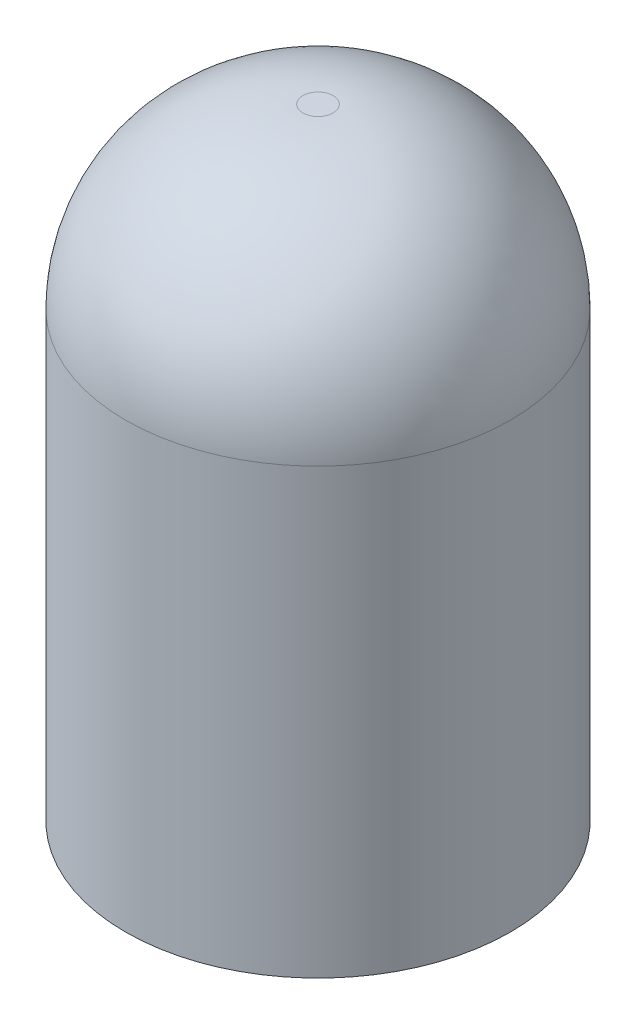
ISO-10303-21;
HEADER;
FILE_DESCRIPTION(('STEP AP214'),'2;1');
FILE_NAME('part.step','',(''),(''),'','','');
FILE_SCHEMA(('AUTOMOTIVE_DESIGN { 1 0 10303 214 1 1 1 1 }'));
ENDSEC;
DATA;
#1=APPLICATION_CONTEXT('core data for automotive mechanical design processes');
#2=APPLICATION_PROTOCOL_DEFINITION('international standard','automotive_design',2000,#1);
#3=PRODUCT_CONTEXT('',#1,'mechanical');
#4=PRODUCT('Part','Part','',(#3));
#5=PRODUCT_RELATED_PRODUCT_CATEGORY('part','',(#4));
#6=PRODUCT_DEFINITION_FORMATION('','',#4);
#7=PRODUCT_DEFINITION_CONTEXT('part definition',#1,'design');
#8=PRODUCT_DEFINITION('design','',#6,#7);
#9=PRODUCT_DEFINITION_SHAPE('','',#8);
#10=(LENGTH_UNIT() NAMED_UNIT(*) SI_UNIT(.MILLI.,.METRE.));
#11=(NAMED_UNIT(*) PLANE_ANGLE_UNIT() SI_UNIT($,.RADIAN.));
#12=(NAMED_UNIT(*) SI_UNIT($,.STERADIAN.) SOLID_ANGLE_UNIT());
#13=UNCERTAINTY_MEASURE_WITH_UNIT(LENGTH_MEASURE(1.E-05),#10,'distance_accuracy_value','');
#14=(GEOMETRIC_REPRESENTATION_CONTEXT(3) GLOBAL_UNCERTAINTY_ASSIGNED_CONTEXT((#13)) GLOBAL_UNIT_ASSIGNED_CONTEXT((#10,
#11,#12)) REPRESENTATION_CONTEXT('',''));
#15=CARTESIAN_POINT('',(0.,0.,0.));
#16=DIRECTION('',(0.,0.,1.));
#17=DIRECTION('',(1.,0.,0.));
#18=AXIS2_PLACEMENT_3D('',#15,#16,#17);
#19=CARTESIAN_POINT('',(0.,7.,0.));
#20=DIRECTION('',(0.,-1.,0.));
#21=DIRECTION('',(0.,0.,-1.));
#22=AXIS2_PLACEMENT_3D('',#19,#20,#21);
#23=CYLINDRICAL_SURFACE('',#22,2.17);
#24=CARTESIAN_POINT('',(0.,5.,0.));
#25=DIRECTION('',(0.,1.,0.));
#26=DIRECTION('',(0.,0.,1.));
#27=AXIS2_PLACEMENT_3D('',#24,#25,#26);
#28=CIRCLE('',#27,2.17);
#29=CARTESIAN_POINT('',(0.,5.,2.17));
#30=VERTEX_POINT('',#29);
#31=EDGE_CURVE('E10',#30,#30,#28,.F.);
#32=ORIENTED_EDGE('',*,*,#31,.T.);
#33=EDGE_LOOP('',(#32));
#34=FACE_BOUND('',#33,.T.);
#35=CARTESIAN_POINT('',(0.,0.,0.));
#36=DIRECTION('',(0.,1.,0.));
#37=DIRECTION('',(0.,0.,1.));
#38=AXIS2_PLACEMENT_3D('',#35,#36,#37);
#39=CIRCLE('',#38,2.17);
#40=CARTESIAN_POINT('',(0.,0.,2.17));
#41=VERTEX_POINT('',#40);
#42=EDGE_CURVE('E42',#41,#41,#39,.T.);
#43=ORIENTED_EDGE('',*,*,#42,.T.);
#44=EDGE_LOOP('',(#43));
#45=FACE_BOUND('',#44,.T.);
#46=ADVANCED_FACE('F31',(#34,#45),#23,.T.);
#47=CARTESIAN_POINT('',(0.,7.,0.));
#48=DIRECTION('',(0.,1.,0.));
#49=DIRECTION('',(0.,0.,1.));
#50=AXIS2_PLACEMENT_3D('',#47,#48,#49);
#51=PLANE('',#50);
#52=CARTESIAN_POINT('',(0.,7.,0.));
#53=DIRECTION('',(0.,1.,0.));
#54=DIRECTION('',(0.,0.,1.));
#55=AXIS2_PLACEMENT_3D('',#52,#53,#54);
#56=CIRCLE('',#55,0.17);
#57=CARTESIAN_POINT('',(0.,7.,0.17));
#58=VERTEX_POINT('',#57);
#59=EDGE_CURVE('E38',#58,#58,#56,.T.);
#60=ORIENTED_EDGE('',*,*,#59,.T.);
#61=EDGE_LOOP('',(#60));
#62=FACE_BOUND('',#61,.T.);
#63=ADVANCED_FACE('F52',(#62),#51,.T.);
#64=CARTESIAN_POINT('',(0.,0.,0.));
#65=DIRECTION('',(0.,1.,0.));
#66=DIRECTION('',(0.,0.,1.));
#67=AXIS2_PLACEMENT_3D('',#64,#65,#66);
#68=PLANE('',#67);
#69=ORIENTED_EDGE('',*,*,#42,.F.);
#70=EDGE_LOOP('',(#69));
#71=FACE_BOUND('',#70,.T.);
#72=ADVANCED_FACE('F50',(#71),#68,.F.);
#73=CARTESIAN_POINT('',(0.,5.,0.));
#74=DIRECTION('',(0.,1.,0.));
#75=DIRECTION('',(0.,0.,1.));
#76=AXIS2_PLACEMENT_3D('',#73,#74,#75);
#77=DEGENERATE_TOROIDAL_SURFACE('',#76,0.17,2.,.T.);
#78=ORIENTED_EDGE('',*,*,#31,.F.);
#79=EDGE_LOOP('',(#78));
#80=FACE_BOUND('',#79,.T.);
#81=ORIENTED_EDGE('',*,*,#59,.F.);
#82=EDGE_LOOP('',(#81));
#83=FACE_BOUND('',#82,.T.);
#84=ADVANCED_FACE('F33',(#80,#83),#77,.T.);
#85=CLOSED_SHELL('',(#46,#63,#72,#84));
#86=MANIFOLD_SOLID_BREP('B2',#85);
#87=ADVANCED_BREP_SHAPE_REPRESENTATION('',(#18,#86),#14);
#88=SHAPE_DEFINITION_REPRESENTATION(#9,#87);
ENDSEC;
END-ISO-10303-21;
